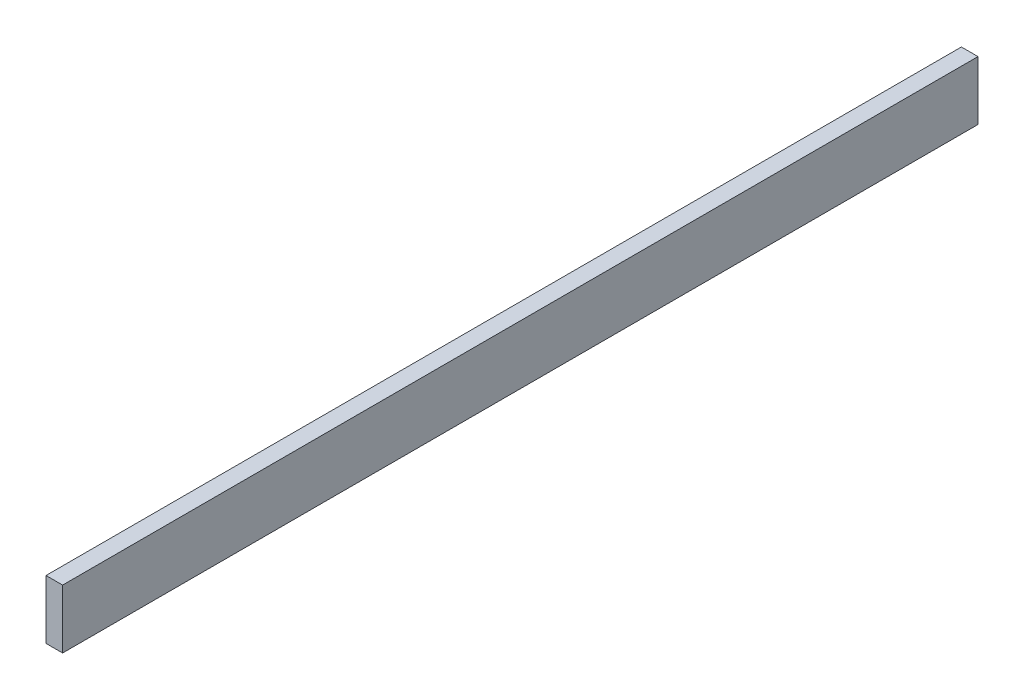
ISO-10303-21;
HEADER;
FILE_DESCRIPTION(('STEP AP214'),'2;1');
FILE_NAME('part.step','',(''),(''),'','','');
FILE_SCHEMA(('AUTOMOTIVE_DESIGN { 1 0 10303 214 1 1 1 1 }'));
ENDSEC;
DATA;
#1=APPLICATION_CONTEXT('core data for automotive mechanical design processes');
#2=APPLICATION_PROTOCOL_DEFINITION('international standard','automotive_design',2000,#1);
#3=PRODUCT_CONTEXT('',#1,'mechanical');
#4=PRODUCT('Part','Part','',(#3));
#5=PRODUCT_RELATED_PRODUCT_CATEGORY('part','',(#4));
#6=PRODUCT_DEFINITION_FORMATION('','',#4);
#7=PRODUCT_DEFINITION_CONTEXT('part definition',#1,'design');
#8=PRODUCT_DEFINITION('design','',#6,#7);
#9=PRODUCT_DEFINITION_SHAPE('','',#8);
#10=(LENGTH_UNIT() NAMED_UNIT(*) SI_UNIT(.MILLI.,.METRE.));
#11=(NAMED_UNIT(*) PLANE_ANGLE_UNIT() SI_UNIT($,.RADIAN.));
#12=(NAMED_UNIT(*) SI_UNIT($,.STERADIAN.) SOLID_ANGLE_UNIT());
#13=UNCERTAINTY_MEASURE_WITH_UNIT(LENGTH_MEASURE(1.E-05),#10,'distance_accuracy_value','');
#14=(GEOMETRIC_REPRESENTATION_CONTEXT(3) GLOBAL_UNCERTAINTY_ASSIGNED_CONTEXT((#13)) GLOBAL_UNIT_ASSIGNED_CONTEXT((#10,
#11,#12)) REPRESENTATION_CONTEXT('',''));
#15=CARTESIAN_POINT('',(0.,0.,0.));
#16=DIRECTION('',(0.,0.,1.));
#17=DIRECTION('',(1.,0.,0.));
#18=AXIS2_PLACEMENT_3D('',#15,#16,#17);
#19=CARTESIAN_POINT('',(714.,1527.,-700.));
#20=DIRECTION('',(-1.,0.,0.));
#21=DIRECTION('',(0.,0.,1.));
#22=AXIS2_PLACEMENT_3D('',#19,#20,#21);
#23=PLANE('',#22);
#24=DIRECTION('',(0.,-1.,0.));
#25=VECTOR('',#24,1.);
#26=CARTESIAN_POINT('',(714.,1527.,0.));
#27=LINE('',#26,#25);
#28=CARTESIAN_POINT('',(714.,1572.,0.));
#29=VERTEX_POINT('',#28);
#30=CARTESIAN_POINT('',(714.,1527.,0.));
#31=VERTEX_POINT('',#30);
#32=EDGE_CURVE('E103',#29,#31,#27,.T.);
#33=ORIENTED_EDGE('',*,*,#32,.F.);
#34=DIRECTION('',(0.,0.,1.));
#35=VECTOR('',#34,1.);
#36=CARTESIAN_POINT('',(714.,1572.,-700.));
#37=LINE('',#36,#35);
#38=CARTESIAN_POINT('',(714.,1572.,-700.));
#39=VERTEX_POINT('',#38);
#40=EDGE_CURVE('E11',#39,#29,#37,.T.);
#41=ORIENTED_EDGE('',*,*,#40,.F.);
#42=DIRECTION('',(0.,-1.,0.));
#43=VECTOR('',#42,1.);
#44=CARTESIAN_POINT('',(714.,1527.,-700.));
#45=LINE('',#44,#43);
#46=CARTESIAN_POINT('',(714.,1527.,-700.));
#47=VERTEX_POINT('',#46);
#48=EDGE_CURVE('E97',#39,#47,#45,.T.);
#49=ORIENTED_EDGE('',*,*,#48,.T.);
#50=DIRECTION('',(0.,0.,1.));
#51=VECTOR('',#50,1.);
#52=CARTESIAN_POINT('',(714.,1527.,-700.));
#53=LINE('',#52,#51);
#54=EDGE_CURVE('E42',#47,#31,#53,.T.);
#55=ORIENTED_EDGE('',*,*,#54,.T.);
#56=EDGE_LOOP('',(#33,#41,#49,#55));
#57=FACE_BOUND('',#56,.T.);
#58=ADVANCED_FACE('F39',(#57),#23,.T.);
#59=CARTESIAN_POINT('',(714.,1572.,-700.));
#60=DIRECTION('',(0.,1.,0.));
#61=DIRECTION('',(0.,0.,1.));
#62=AXIS2_PLACEMENT_3D('',#59,#60,#61);
#63=PLANE('',#62);
#64=DIRECTION('',(-1.,0.,0.));
#65=VECTOR('',#64,1.);
#66=CARTESIAN_POINT('',(714.,1572.,0.));
#67=LINE('',#66,#65);
#68=CARTESIAN_POINT('',(726.7,1572.,0.));
#69=VERTEX_POINT('',#68);
#70=EDGE_CURVE('E99',#69,#29,#67,.T.);
#71=ORIENTED_EDGE('',*,*,#70,.F.);
#72=DIRECTION('',(0.,0.,1.));
#73=VECTOR('',#72,1.);
#74=CARTESIAN_POINT('',(726.7,1572.,-700.));
#75=LINE('',#74,#73);
#76=CARTESIAN_POINT('',(726.7,1572.,-700.));
#77=VERTEX_POINT('',#76);
#78=EDGE_CURVE('E48',#77,#69,#75,.T.);
#79=ORIENTED_EDGE('',*,*,#78,.F.);
#80=DIRECTION('',(-1.,0.,0.));
#81=VECTOR('',#80,1.);
#82=CARTESIAN_POINT('',(714.,1572.,-700.));
#83=LINE('',#82,#81);
#84=EDGE_CURVE('E94',#77,#39,#83,.T.);
#85=ORIENTED_EDGE('',*,*,#84,.T.);
#86=ORIENTED_EDGE('',*,*,#40,.T.);
#87=EDGE_LOOP('',(#71,#79,#85,#86));
#88=FACE_BOUND('',#87,.T.);
#89=ADVANCED_FACE('F113',(#88),#63,.T.);
#90=CARTESIAN_POINT('',(726.7,1527.,-700.));
#91=DIRECTION('',(1.,0.,0.));
#92=DIRECTION('',(0.,0.,-1.));
#93=AXIS2_PLACEMENT_3D('',#90,#91,#92);
#94=PLANE('',#93);
#95=DIRECTION('',(0.,1.,0.));
#96=VECTOR('',#95,1.);
#97=CARTESIAN_POINT('',(726.7,1527.,0.));
#98=LINE('',#97,#96);
#99=CARTESIAN_POINT('',(726.7,1527.,0.));
#100=VERTEX_POINT('',#99);
#101=EDGE_CURVE('E89',#100,#69,#98,.T.);
#102=ORIENTED_EDGE('',*,*,#101,.F.);
#103=DIRECTION('',(0.,0.,1.));
#104=VECTOR('',#103,1.);
#105=CARTESIAN_POINT('',(726.7,1527.,-700.));
#106=LINE('',#105,#104);
#107=CARTESIAN_POINT('',(726.7,1527.,-700.));
#108=VERTEX_POINT('',#107);
#109=EDGE_CURVE('E84',#108,#100,#106,.T.);
#110=ORIENTED_EDGE('',*,*,#109,.F.);
#111=DIRECTION('',(0.,1.,0.));
#112=VECTOR('',#111,1.);
#113=CARTESIAN_POINT('',(726.7,1527.,-700.));
#114=LINE('',#113,#112);
#115=EDGE_CURVE('E87',#108,#77,#114,.T.);
#116=ORIENTED_EDGE('',*,*,#115,.T.);
#117=ORIENTED_EDGE('',*,*,#78,.T.);
#118=EDGE_LOOP('',(#102,#110,#116,#117));
#119=FACE_BOUND('',#118,.T.);
#120=ADVANCED_FACE('F86',(#119),#94,.T.);
#121=CARTESIAN_POINT('',(714.,1527.,-700.));
#122=DIRECTION('',(0.,-1.,0.));
#123=DIRECTION('',(0.,0.,-1.));
#124=AXIS2_PLACEMENT_3D('',#121,#122,#123);
#125=PLANE('',#124);
#126=DIRECTION('',(1.,0.,0.));
#127=VECTOR('',#126,1.);
#128=CARTESIAN_POINT('',(714.,1527.,0.));
#129=LINE('',#128,#127);
#130=EDGE_CURVE('E106',#31,#100,#129,.T.);
#131=ORIENTED_EDGE('',*,*,#130,.F.);
#132=ORIENTED_EDGE('',*,*,#54,.F.);
#133=DIRECTION('',(1.,0.,0.));
#134=VECTOR('',#133,1.);
#135=CARTESIAN_POINT('',(714.,1527.,-700.));
#136=LINE('',#135,#134);
#137=EDGE_CURVE('E93',#47,#108,#136,.T.);
#138=ORIENTED_EDGE('',*,*,#137,.T.);
#139=ORIENTED_EDGE('',*,*,#109,.T.);
#140=EDGE_LOOP('',(#131,#132,#138,#139));
#141=FACE_BOUND('',#140,.T.);
#142=ADVANCED_FACE('F96',(#141),#125,.T.);
#143=CARTESIAN_POINT('',(0.,0.,-700.));
#144=DIRECTION('',(0.,0.,-1.));
#145=DIRECTION('',(-1.,0.,0.));
#146=AXIS2_PLACEMENT_3D('',#143,#144,#145);
#147=PLANE('',#146);
#148=ORIENTED_EDGE('',*,*,#48,.F.);
#149=ORIENTED_EDGE('',*,*,#84,.F.);
#150=ORIENTED_EDGE('',*,*,#115,.F.);
#151=ORIENTED_EDGE('',*,*,#137,.F.);
#152=EDGE_LOOP('',(#148,#149,#150,#151));
#153=FACE_BOUND('',#152,.T.);
#154=ADVANCED_FACE('F92',(#153),#147,.T.);
#155=CARTESIAN_POINT('',(0.,0.,0.));
#156=DIRECTION('',(0.,0.,-1.));
#157=DIRECTION('',(-1.,0.,0.));
#158=AXIS2_PLACEMENT_3D('',#155,#156,#157);
#159=PLANE('',#158);
#160=ORIENTED_EDGE('',*,*,#32,.T.);
#161=ORIENTED_EDGE('',*,*,#130,.T.);
#162=ORIENTED_EDGE('',*,*,#101,.T.);
#163=ORIENTED_EDGE('',*,*,#70,.T.);
#164=EDGE_LOOP('',(#160,#161,#162,#163));
#165=FACE_BOUND('',#164,.T.);
#166=ADVANCED_FACE('F112',(#165),#159,.F.);
#167=CLOSED_SHELL('',(#58,#89,#120,#142,#154,#166));
#168=MANIFOLD_SOLID_BREP('B2',#167);
#169=ADVANCED_BREP_SHAPE_REPRESENTATION('',(#18,#168),#14);
#170=SHAPE_DEFINITION_REPRESENTATION(#9,#169);
ENDSEC;
END-ISO-10303-21;
